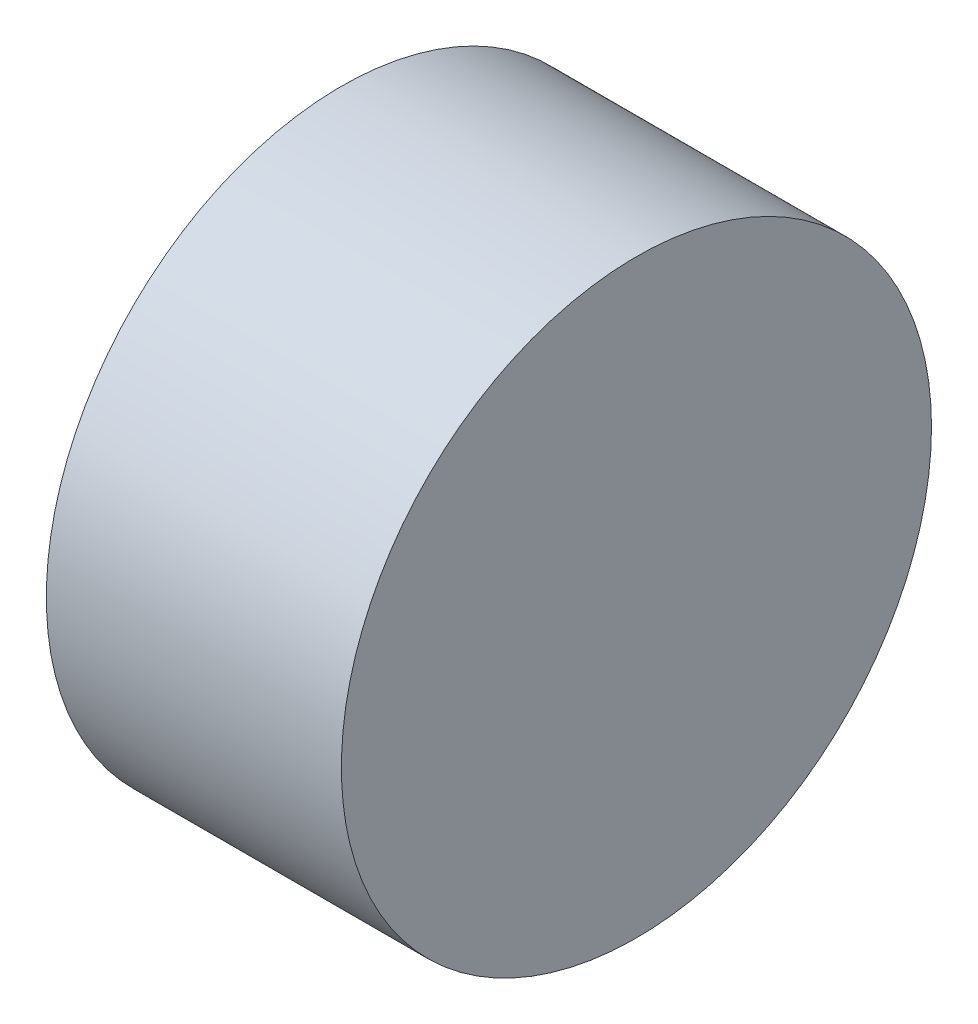
ISO-10303-21;
HEADER;
FILE_DESCRIPTION(('STEP AP214'),'2;1');
FILE_NAME('part.step','',(''),(''),'','','');
FILE_SCHEMA(('AUTOMOTIVE_DESIGN { 1 0 10303 214 1 1 1 1 }'));
ENDSEC;
DATA;
#1=APPLICATION_CONTEXT('core data for automotive mechanical design processes');
#2=APPLICATION_PROTOCOL_DEFINITION('international standard','automotive_design',2000,#1);
#3=PRODUCT_CONTEXT('',#1,'mechanical');
#4=PRODUCT('Part','Part','',(#3));
#5=PRODUCT_RELATED_PRODUCT_CATEGORY('part','',(#4));
#6=PRODUCT_DEFINITION_FORMATION('','',#4);
#7=PRODUCT_DEFINITION_CONTEXT('part definition',#1,'design');
#8=PRODUCT_DEFINITION('design','',#6,#7);
#9=PRODUCT_DEFINITION_SHAPE('','',#8);
#10=(LENGTH_UNIT() NAMED_UNIT(*) SI_UNIT(.MILLI.,.METRE.));
#11=(NAMED_UNIT(*) PLANE_ANGLE_UNIT() SI_UNIT($,.RADIAN.));
#12=(NAMED_UNIT(*) SI_UNIT($,.STERADIAN.) SOLID_ANGLE_UNIT());
#13=UNCERTAINTY_MEASURE_WITH_UNIT(LENGTH_MEASURE(1.E-05),#10,'distance_accuracy_value','');
#14=(GEOMETRIC_REPRESENTATION_CONTEXT(3) GLOBAL_UNCERTAINTY_ASSIGNED_CONTEXT((#13)) GLOBAL_UNIT_ASSIGNED_CONTEXT((#10,
#11,#12)) REPRESENTATION_CONTEXT('',''));
#15=CARTESIAN_POINT('',(0.,0.,0.));
#16=DIRECTION('',(0.,0.,1.));
#17=DIRECTION('',(1.,0.,0.));
#18=AXIS2_PLACEMENT_3D('',#15,#16,#17);
#19=CARTESIAN_POINT('',(25.4,0.,0.));
#20=DIRECTION('',(-1.,0.,0.));
#21=DIRECTION('',(0.,0.,1.));
#22=AXIS2_PLACEMENT_3D('',#19,#20,#21);
#23=CYLINDRICAL_SURFACE('',#22,50.8);
#24=CARTESIAN_POINT('',(25.4,0.,0.));
#25=DIRECTION('',(1.,0.,0.));
#26=DIRECTION('',(0.,0.,-1.));
#27=AXIS2_PLACEMENT_3D('',#24,#25,#26);
#28=CIRCLE('',#27,50.8);
#29=CARTESIAN_POINT('',(25.4,0.,-50.8));
#30=VERTEX_POINT('',#29);
#31=EDGE_CURVE('E10',#30,#30,#28,.T.);
#32=ORIENTED_EDGE('',*,*,#31,.F.);
#33=EDGE_LOOP('',(#32));
#34=FACE_BOUND('',#33,.T.);
#35=CARTESIAN_POINT('',(-25.4,0.,0.));
#36=DIRECTION('',(1.,0.,0.));
#37=DIRECTION('',(0.,0.,-1.));
#38=AXIS2_PLACEMENT_3D('',#35,#36,#37);
#39=CIRCLE('',#38,50.8);
#40=CARTESIAN_POINT('',(-25.4,0.,-50.8));
#41=VERTEX_POINT('',#40);
#42=EDGE_CURVE('E36',#41,#41,#39,.T.);
#43=ORIENTED_EDGE('',*,*,#42,.T.);
#44=EDGE_LOOP('',(#43));
#45=FACE_BOUND('',#44,.T.);
#46=ADVANCED_FACE('F33',(#34,#45),#23,.T.);
#47=CARTESIAN_POINT('',(25.4,0.,0.));
#48=DIRECTION('',(1.,0.,0.));
#49=DIRECTION('',(0.,0.,-1.));
#50=AXIS2_PLACEMENT_3D('',#47,#48,#49);
#51=PLANE('',#50);
#52=ORIENTED_EDGE('',*,*,#31,.T.);
#53=EDGE_LOOP('',(#52));
#54=FACE_BOUND('',#53,.T.);
#55=ADVANCED_FACE('F48',(#54),#51,.T.);
#56=CARTESIAN_POINT('',(-25.4,0.,0.));
#57=DIRECTION('',(1.,0.,0.));
#58=DIRECTION('',(0.,0.,-1.));
#59=AXIS2_PLACEMENT_3D('',#56,#57,#58);
#60=PLANE('',#59);
#61=ORIENTED_EDGE('',*,*,#42,.F.);
#62=EDGE_LOOP('',(#61));
#63=FACE_BOUND('',#62,.T.);
#64=ADVANCED_FACE('F46',(#63),#60,.F.);
#65=CLOSED_SHELL('',(#46,#55,#64));
#66=MANIFOLD_SOLID_BREP('B2',#65);
#67=ADVANCED_BREP_SHAPE_REPRESENTATION('',(#18,#66),#14);
#68=SHAPE_DEFINITION_REPRESENTATION(#9,#67);
ENDSEC;
END-ISO-10303-21;
